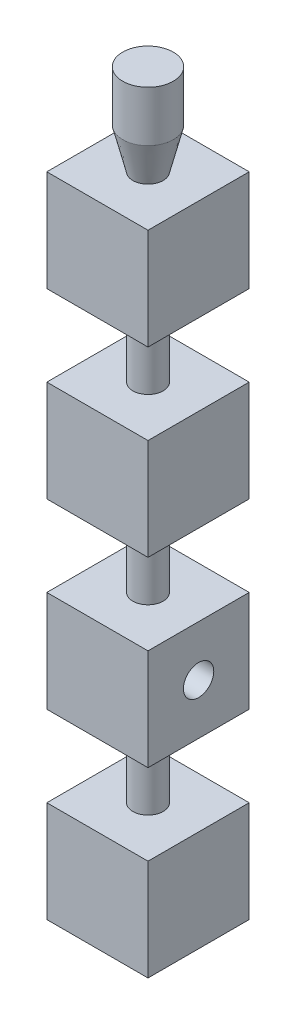
ISO-10303-21;
HEADER;
FILE_DESCRIPTION(('STEP AP214'),'2;1');
FILE_NAME('part.step','',(''),(''),'','','');
FILE_SCHEMA(('AUTOMOTIVE_DESIGN { 1 0 10303 214 1 1 1 1 }'));
ENDSEC;
DATA;
#1=APPLICATION_CONTEXT('core data for automotive mechanical design processes');
#2=APPLICATION_PROTOCOL_DEFINITION('international standard','automotive_design',2000,#1);
#3=PRODUCT_CONTEXT('',#1,'mechanical');
#4=PRODUCT('Part','Part','',(#3));
#5=PRODUCT_RELATED_PRODUCT_CATEGORY('part','',(#4));
#6=PRODUCT_DEFINITION_FORMATION('','',#4);
#7=PRODUCT_DEFINITION_CONTEXT('part definition',#1,'design');
#8=PRODUCT_DEFINITION('design','',#6,#7);
#9=PRODUCT_DEFINITION_SHAPE('','',#8);
#10=(LENGTH_UNIT() NAMED_UNIT(*) SI_UNIT(.MILLI.,.METRE.));
#11=(NAMED_UNIT(*) PLANE_ANGLE_UNIT() SI_UNIT($,.RADIAN.));
#12=(NAMED_UNIT(*) SI_UNIT($,.STERADIAN.) SOLID_ANGLE_UNIT());
#13=UNCERTAINTY_MEASURE_WITH_UNIT(LENGTH_MEASURE(1.E-05),#10,'distance_accuracy_value','');
#14=(GEOMETRIC_REPRESENTATION_CONTEXT(3) GLOBAL_UNCERTAINTY_ASSIGNED_CONTEXT((#13)) GLOBAL_UNIT_ASSIGNED_CONTEXT((#10,
#11,#12)) REPRESENTATION_CONTEXT('',''));
#15=CARTESIAN_POINT('',(0.,0.,0.));
#16=DIRECTION('',(0.,0.,1.));
#17=DIRECTION('',(1.,0.,0.));
#18=AXIS2_PLACEMENT_3D('',#15,#16,#17);
#19=CARTESIAN_POINT('',(0.,12.7,0.));
#20=DIRECTION('',(1.,0.,0.));
#21=DIRECTION('',(0.,0.,-1.));
#22=AXIS2_PLACEMENT_3D('',#19,#20,#21);
#23=PLANE('',#22);
#24=DIRECTION('',(0.,0.,1.));
#25=VECTOR('',#24,1.);
#26=CARTESIAN_POINT('',(0.,0.,0.));
#27=LINE('',#26,#25);
#28=CARTESIAN_POINT('',(0.,0.,0.));
#29=VERTEX_POINT('',#28);
#30=CARTESIAN_POINT('',(0.,0.,12.7));
#31=VERTEX_POINT('',#30);
#32=EDGE_CURVE('E290',#29,#31,#27,.T.);
#33=ORIENTED_EDGE('',*,*,#32,.T.);
#34=DIRECTION('',(0.,-1.,0.));
#35=VECTOR('',#34,1.);
#36=CARTESIAN_POINT('',(0.,12.7,12.7));
#37=LINE('',#36,#35);
#38=CARTESIAN_POINT('',(0.,12.7,12.7));
#39=VERTEX_POINT('',#38);
#40=EDGE_CURVE('E47',#39,#31,#37,.T.);
#41=ORIENTED_EDGE('',*,*,#40,.F.);
#42=DIRECTION('',(0.,0.,1.));
#43=VECTOR('',#42,1.);
#44=CARTESIAN_POINT('',(0.,12.7,0.));
#45=LINE('',#44,#43);
#46=CARTESIAN_POINT('',(0.,12.7,0.));
#47=VERTEX_POINT('',#46);
#48=EDGE_CURVE('E339',#47,#39,#45,.T.);
#49=ORIENTED_EDGE('',*,*,#48,.F.);
#50=DIRECTION('',(0.,-1.,0.));
#51=VECTOR('',#50,1.);
#52=CARTESIAN_POINT('',(0.,12.7,0.));
#53=LINE('',#52,#51);
#54=EDGE_CURVE('E349',#47,#29,#53,.T.);
#55=ORIENTED_EDGE('',*,*,#54,.T.);
#56=EDGE_LOOP('',(#33,#41,#49,#55));
#57=FACE_BOUND('',#56,.T.);
#58=ADVANCED_FACE('F44',(#57),#23,.F.);
#59=CARTESIAN_POINT('',(0.,12.7,12.7));
#60=DIRECTION('',(0.,0.,-1.));
#61=DIRECTION('',(-1.,0.,0.));
#62=AXIS2_PLACEMENT_3D('',#59,#60,#61);
#63=PLANE('',#62);
#64=DIRECTION('',(1.,0.,0.));
#65=VECTOR('',#64,1.);
#66=CARTESIAN_POINT('',(0.,0.,12.7));
#67=LINE('',#66,#65);
#68=CARTESIAN_POINT('',(12.7,0.,12.7));
#69=VERTEX_POINT('',#68);
#70=EDGE_CURVE('E353',#31,#69,#67,.T.);
#71=ORIENTED_EDGE('',*,*,#70,.T.);
#72=DIRECTION('',(0.,-1.,0.));
#73=VECTOR('',#72,1.);
#74=CARTESIAN_POINT('',(12.7,12.7,12.7));
#75=LINE('',#74,#73);
#76=CARTESIAN_POINT('',(12.7,12.7,12.7));
#77=VERTEX_POINT('',#76);
#78=EDGE_CURVE('E364',#77,#69,#75,.T.);
#79=ORIENTED_EDGE('',*,*,#78,.F.);
#80=DIRECTION('',(1.,0.,0.));
#81=VECTOR('',#80,1.);
#82=CARTESIAN_POINT('',(0.,12.7,12.7));
#83=LINE('',#82,#81);
#84=EDGE_CURVE('E95',#39,#77,#83,.T.);
#85=ORIENTED_EDGE('',*,*,#84,.F.);
#86=ORIENTED_EDGE('',*,*,#40,.T.);
#87=EDGE_LOOP('',(#71,#79,#85,#86));
#88=FACE_BOUND('',#87,.T.);
#89=ADVANCED_FACE('F369',(#88),#63,.F.);
#90=CARTESIAN_POINT('',(12.7,12.7,0.));
#91=DIRECTION('',(-1.,0.,0.));
#92=DIRECTION('',(0.,0.,1.));
#93=AXIS2_PLACEMENT_3D('',#90,#91,#92);
#94=PLANE('',#93);
#95=DIRECTION('',(0.,0.,-1.));
#96=VECTOR('',#95,1.);
#97=CARTESIAN_POINT('',(12.7,0.,0.));
#98=LINE('',#97,#96);
#99=CARTESIAN_POINT('',(12.7,0.,0.));
#100=VERTEX_POINT('',#99);
#101=EDGE_CURVE('E81',#69,#100,#98,.T.);
#102=ORIENTED_EDGE('',*,*,#101,.T.);
#103=DIRECTION('',(0.,-1.,0.));
#104=VECTOR('',#103,1.);
#105=CARTESIAN_POINT('',(12.7,12.7,0.));
#106=LINE('',#105,#104);
#107=CARTESIAN_POINT('',(12.7,12.7,0.));
#108=VERTEX_POINT('',#107);
#109=EDGE_CURVE('E362',#108,#100,#106,.T.);
#110=ORIENTED_EDGE('',*,*,#109,.F.);
#111=DIRECTION('',(0.,0.,-1.));
#112=VECTOR('',#111,1.);
#113=CARTESIAN_POINT('',(12.7,12.7,0.));
#114=LINE('',#113,#112);
#115=EDGE_CURVE('E344',#77,#108,#114,.T.);
#116=ORIENTED_EDGE('',*,*,#115,.F.);
#117=ORIENTED_EDGE('',*,*,#78,.T.);
#118=EDGE_LOOP('',(#102,#110,#116,#117));
#119=FACE_BOUND('',#118,.T.);
#120=ADVANCED_FACE('F395',(#119),#94,.F.);
#121=CARTESIAN_POINT('',(0.,12.7,0.));
#122=DIRECTION('',(0.,0.,1.));
#123=DIRECTION('',(1.,0.,0.));
#124=AXIS2_PLACEMENT_3D('',#121,#122,#123);
#125=PLANE('',#124);
#126=DIRECTION('',(-1.,0.,0.));
#127=VECTOR('',#126,1.);
#128=CARTESIAN_POINT('',(0.,0.,0.));
#129=LINE('',#128,#127);
#130=EDGE_CURVE('E87',#100,#29,#129,.T.);
#131=ORIENTED_EDGE('',*,*,#130,.T.);
#132=ORIENTED_EDGE('',*,*,#54,.F.);
#133=DIRECTION('',(-1.,0.,0.));
#134=VECTOR('',#133,1.);
#135=CARTESIAN_POINT('',(0.,12.7,0.));
#136=LINE('',#135,#134);
#137=EDGE_CURVE('E63',#108,#47,#136,.T.);
#138=ORIENTED_EDGE('',*,*,#137,.F.);
#139=ORIENTED_EDGE('',*,*,#109,.T.);
#140=EDGE_LOOP('',(#131,#132,#138,#139));
#141=FACE_BOUND('',#140,.T.);
#142=ADVANCED_FACE('F387',(#141),#125,.F.);
#143=CARTESIAN_POINT('',(0.,12.7,0.));
#144=DIRECTION('',(0.,1.,0.));
#145=DIRECTION('',(0.,0.,1.));
#146=AXIS2_PLACEMENT_3D('',#143,#144,#145);
#147=PLANE('',#146);
#148=CARTESIAN_POINT('',(6.35,12.7,6.35));
#149=DIRECTION('',(0.,1.,0.));
#150=DIRECTION('',(0.,0.,1.));
#151=AXIS2_PLACEMENT_3D('',#148,#149,#150);
#152=CIRCLE('',#151,1.905);
#153=CARTESIAN_POINT('',(6.35,12.7,8.255));
#154=VERTEX_POINT('',#153);
#155=EDGE_CURVE('E285',#154,#154,#152,.T.);
#156=ORIENTED_EDGE('',*,*,#155,.F.);
#157=EDGE_LOOP('',(#156));
#158=FACE_BOUND('',#157,.T.);
#159=ORIENTED_EDGE('',*,*,#48,.T.);
#160=ORIENTED_EDGE('',*,*,#84,.T.);
#161=ORIENTED_EDGE('',*,*,#115,.T.);
#162=ORIENTED_EDGE('',*,*,#137,.T.);
#163=EDGE_LOOP('',(#159,#160,#161,#162));
#164=FACE_BOUND('',#163,.T.);
#165=ADVANCED_FACE('F377',(#158,#164),#147,.T.);
#166=CARTESIAN_POINT('',(0.,0.,0.));
#167=DIRECTION('',(0.,1.,0.));
#168=DIRECTION('',(0.,0.,1.));
#169=AXIS2_PLACEMENT_3D('',#166,#167,#168);
#170=PLANE('',#169);
#171=ORIENTED_EDGE('',*,*,#32,.F.);
#172=ORIENTED_EDGE('',*,*,#130,.F.);
#173=ORIENTED_EDGE('',*,*,#101,.F.);
#174=ORIENTED_EDGE('',*,*,#70,.F.);
#175=EDGE_LOOP('',(#171,#172,#173,#174));
#176=FACE_BOUND('',#175,.T.);
#177=ADVANCED_FACE('F374',(#176),#170,.F.);
#178=CARTESIAN_POINT('',(6.35,17.78,6.35));
#179=DIRECTION('',(0.,-1.,0.));
#180=DIRECTION('',(0.,0.,-1.));
#181=AXIS2_PLACEMENT_3D('',#178,#179,#180);
#182=CYLINDRICAL_SURFACE('',#181,1.905);
#183=ORIENTED_EDGE('',*,*,#155,.T.);
#184=EDGE_LOOP('',(#183));
#185=FACE_BOUND('',#184,.T.);
#186=CARTESIAN_POINT('',(6.35,22.86,6.35));
#187=DIRECTION('',(0.,1.,0.));
#188=DIRECTION('',(0.,0.,1.));
#189=AXIS2_PLACEMENT_3D('',#186,#187,#188);
#190=CIRCLE('',#189,1.905);
#191=CARTESIAN_POINT('',(6.35,22.86,8.255));
#192=VERTEX_POINT('',#191);
#193=EDGE_CURVE('E286',#192,#192,#190,.T.);
#194=ORIENTED_EDGE('',*,*,#193,.F.);
#195=EDGE_LOOP('',(#194));
#196=FACE_BOUND('',#195,.T.);
#197=ADVANCED_FACE('F376',(#185,#196),#182,.T.);
#198=CARTESIAN_POINT('',(0.,22.86,0.));
#199=DIRECTION('',(1.,0.,0.));
#200=DIRECTION('',(0.,0.,-1.));
#201=AXIS2_PLACEMENT_3D('',#198,#199,#200);
#202=PLANE('',#201);
#203=DIRECTION('',(0.,0.,1.));
#204=VECTOR('',#203,1.);
#205=CARTESIAN_POINT('',(0.,35.56,0.));
#206=LINE('',#205,#204);
#207=CARTESIAN_POINT('',(0.,35.56,0.));
#208=VERTEX_POINT('',#207);
#209=CARTESIAN_POINT('',(0.,35.56,12.7));
#210=VERTEX_POINT('',#209);
#211=EDGE_CURVE('E281',#208,#210,#206,.T.);
#212=ORIENTED_EDGE('',*,*,#211,.F.);
#213=DIRECTION('',(0.,1.,0.));
#214=VECTOR('',#213,1.);
#215=CARTESIAN_POINT('',(0.,22.86,0.));
#216=LINE('',#215,#214);
#217=CARTESIAN_POINT('',(0.,22.86,0.));
#218=VERTEX_POINT('',#217);
#219=EDGE_CURVE('E308',#218,#208,#216,.T.);
#220=ORIENTED_EDGE('',*,*,#219,.F.);
#221=DIRECTION('',(0.,0.,1.));
#222=VECTOR('',#221,1.);
#223=CARTESIAN_POINT('',(0.,22.86,0.));
#224=LINE('',#223,#222);
#225=CARTESIAN_POINT('',(0.,22.86,12.7));
#226=VERTEX_POINT('',#225);
#227=EDGE_CURVE('E292',#218,#226,#224,.T.);
#228=ORIENTED_EDGE('',*,*,#227,.T.);
#229=DIRECTION('',(0.,1.,0.));
#230=VECTOR('',#229,1.);
#231=CARTESIAN_POINT('',(0.,22.86,12.7));
#232=LINE('',#231,#230);
#233=EDGE_CURVE('E291',#226,#210,#232,.T.);
#234=ORIENTED_EDGE('',*,*,#233,.T.);
#235=EDGE_LOOP('',(#212,#220,#228,#234));
#236=FACE_BOUND('',#235,.T.);
#237=ADVANCED_FACE('F384',(#236),#202,.F.);
#238=CARTESIAN_POINT('',(0.,22.86,12.7));
#239=DIRECTION('',(0.,0.,-1.));
#240=DIRECTION('',(-1.,0.,0.));
#241=AXIS2_PLACEMENT_3D('',#238,#239,#240);
#242=PLANE('',#241);
#243=DIRECTION('',(1.,0.,0.));
#244=VECTOR('',#243,1.);
#245=CARTESIAN_POINT('',(0.,35.56,12.7));
#246=LINE('',#245,#244);
#247=CARTESIAN_POINT('',(12.7,35.56,12.7));
#248=VERTEX_POINT('',#247);
#249=EDGE_CURVE('E312',#210,#248,#246,.T.);
#250=ORIENTED_EDGE('',*,*,#249,.F.);
#251=ORIENTED_EDGE('',*,*,#233,.F.);
#252=DIRECTION('',(1.,0.,0.));
#253=VECTOR('',#252,1.);
#254=CARTESIAN_POINT('',(0.,22.86,12.7));
#255=LINE('',#254,#253);
#256=CARTESIAN_POINT('',(12.7,22.86,12.7));
#257=VERTEX_POINT('',#256);
#258=EDGE_CURVE('E296',#226,#257,#255,.T.);
#259=ORIENTED_EDGE('',*,*,#258,.T.);
#260=DIRECTION('',(0.,1.,0.));
#261=VECTOR('',#260,1.);
#262=CARTESIAN_POINT('',(12.7,22.86,12.7));
#263=LINE('',#262,#261);
#264=EDGE_CURVE('E329',#257,#248,#263,.T.);
#265=ORIENTED_EDGE('',*,*,#264,.T.);
#266=EDGE_LOOP('',(#250,#251,#259,#265));
#267=FACE_BOUND('',#266,.T.);
#268=ADVANCED_FACE('F439',(#267),#242,.F.);
#269=CARTESIAN_POINT('',(12.7,22.86,0.));
#270=DIRECTION('',(-1.,0.,0.));
#271=DIRECTION('',(0.,0.,1.));
#272=AXIS2_PLACEMENT_3D('',#269,#270,#271);
#273=PLANE('',#272);
#274=CARTESIAN_POINT('',(12.7,29.21,6.35));
#275=DIRECTION('',(1.,0.,0.));
#276=DIRECTION('',(0.,0.,-1.));
#277=AXIS2_PLACEMENT_3D('',#274,#275,#276);
#278=CIRCLE('',#277,1.905);
#279=CARTESIAN_POINT('',(12.7,29.21,4.445));
#280=VERTEX_POINT('',#279);
#281=EDGE_CURVE('E685',#280,#280,#278,.T.);
#282=ORIENTED_EDGE('',*,*,#281,.F.);
#283=EDGE_LOOP('',(#282));
#284=FACE_BOUND('',#283,.T.);
#285=DIRECTION('',(0.,0.,-1.));
#286=VECTOR('',#285,1.);
#287=CARTESIAN_POINT('',(12.7,35.56,0.));
#288=LINE('',#287,#286);
#289=CARTESIAN_POINT('',(12.7,35.56,0.));
#290=VERTEX_POINT('',#289);
#291=EDGE_CURVE('E316',#248,#290,#288,.T.);
#292=ORIENTED_EDGE('',*,*,#291,.F.);
#293=ORIENTED_EDGE('',*,*,#264,.F.);
#294=DIRECTION('',(0.,0.,-1.));
#295=VECTOR('',#294,1.);
#296=CARTESIAN_POINT('',(12.7,22.86,0.));
#297=LINE('',#296,#295);
#298=CARTESIAN_POINT('',(12.7,22.86,0.));
#299=VERTEX_POINT('',#298);
#300=EDGE_CURVE('E301',#257,#299,#297,.T.);
#301=ORIENTED_EDGE('',*,*,#300,.T.);
#302=DIRECTION('',(0.,1.,0.));
#303=VECTOR('',#302,1.);
#304=CARTESIAN_POINT('',(12.7,22.86,0.));
#305=LINE('',#304,#303);
#306=EDGE_CURVE('E325',#299,#290,#305,.T.);
#307=ORIENTED_EDGE('',*,*,#306,.T.);
#308=EDGE_LOOP('',(#292,#293,#301,#307));
#309=FACE_BOUND('',#308,.T.);
#310=ADVANCED_FACE('F448',(#284,#309),#273,.F.);
#311=CARTESIAN_POINT('',(0.,22.86,0.));
#312=DIRECTION('',(0.,0.,1.));
#313=DIRECTION('',(1.,0.,0.));
#314=AXIS2_PLACEMENT_3D('',#311,#312,#313);
#315=PLANE('',#314);
#316=DIRECTION('',(-1.,0.,0.));
#317=VECTOR('',#316,1.);
#318=CARTESIAN_POINT('',(0.,35.56,0.));
#319=LINE('',#318,#317);
#320=EDGE_CURVE('E297',#290,#208,#319,.T.);
#321=ORIENTED_EDGE('',*,*,#320,.F.);
#322=ORIENTED_EDGE('',*,*,#306,.F.);
#323=DIRECTION('',(-1.,0.,0.));
#324=VECTOR('',#323,1.);
#325=CARTESIAN_POINT('',(0.,22.86,0.));
#326=LINE('',#325,#324);
#327=EDGE_CURVE('E305',#299,#218,#326,.T.);
#328=ORIENTED_EDGE('',*,*,#327,.T.);
#329=ORIENTED_EDGE('',*,*,#219,.T.);
#330=EDGE_LOOP('',(#321,#322,#328,#329));
#331=FACE_BOUND('',#330,.T.);
#332=ADVANCED_FACE('F457',(#331),#315,.F.);
#333=CARTESIAN_POINT('',(0.,22.86,0.));
#334=DIRECTION('',(0.,-1.,0.));
#335=DIRECTION('',(0.,0.,1.));
#336=AXIS2_PLACEMENT_3D('',#333,#334,#335);
#337=PLANE('',#336);
#338=ORIENTED_EDGE('',*,*,#193,.T.);
#339=EDGE_LOOP('',(#338));
#340=FACE_BOUND('',#339,.T.);
#341=ORIENTED_EDGE('',*,*,#227,.F.);
#342=ORIENTED_EDGE('',*,*,#327,.F.);
#343=ORIENTED_EDGE('',*,*,#300,.F.);
#344=ORIENTED_EDGE('',*,*,#258,.F.);
#345=EDGE_LOOP('',(#341,#342,#343,#344));
#346=FACE_BOUND('',#345,.T.);
#347=ADVANCED_FACE('F466',(#340,#346),#337,.T.);
#348=CARTESIAN_POINT('',(0.,35.56,0.));
#349=DIRECTION('',(0.,-1.,0.));
#350=DIRECTION('',(0.,0.,1.));
#351=AXIS2_PLACEMENT_3D('',#348,#349,#350);
#352=PLANE('',#351);
#353=CARTESIAN_POINT('',(6.35,35.56,6.35));
#354=DIRECTION('',(0.,1.,0.));
#355=DIRECTION('',(0.,0.,1.));
#356=AXIS2_PLACEMENT_3D('',#353,#354,#355);
#357=CIRCLE('',#356,1.905);
#358=CARTESIAN_POINT('',(6.35,35.56,8.255));
#359=VERTEX_POINT('',#358);
#360=EDGE_CURVE('E235',#359,#359,#357,.T.);
#361=ORIENTED_EDGE('',*,*,#360,.F.);
#362=EDGE_LOOP('',(#361));
#363=FACE_BOUND('',#362,.T.);
#364=ORIENTED_EDGE('',*,*,#211,.T.);
#365=ORIENTED_EDGE('',*,*,#249,.T.);
#366=ORIENTED_EDGE('',*,*,#291,.T.);
#367=ORIENTED_EDGE('',*,*,#320,.T.);
#368=EDGE_LOOP('',(#364,#365,#366,#367));
#369=FACE_BOUND('',#368,.T.);
#370=ADVANCED_FACE('F475',(#363,#369),#352,.F.);
#371=CARTESIAN_POINT('',(6.35,40.64,6.35));
#372=DIRECTION('',(0.,-1.,0.));
#373=DIRECTION('',(0.,0.,-1.));
#374=AXIS2_PLACEMENT_3D('',#371,#372,#373);
#375=CYLINDRICAL_SURFACE('',#374,1.905);
#376=ORIENTED_EDGE('',*,*,#360,.T.);
#377=EDGE_LOOP('',(#376));
#378=FACE_BOUND('',#377,.T.);
#379=CARTESIAN_POINT('',(6.35,45.72,6.35));
#380=DIRECTION('',(0.,1.,0.));
#381=DIRECTION('',(0.,0.,1.));
#382=AXIS2_PLACEMENT_3D('',#379,#380,#381);
#383=CIRCLE('',#382,1.905);
#384=CARTESIAN_POINT('',(6.35,45.72,8.255));
#385=VERTEX_POINT('',#384);
#386=EDGE_CURVE('E277',#385,#385,#383,.T.);
#387=ORIENTED_EDGE('',*,*,#386,.F.);
#388=EDGE_LOOP('',(#387));
#389=FACE_BOUND('',#388,.T.);
#390=ADVANCED_FACE('F484',(#378,#389),#375,.T.);
#391=CARTESIAN_POINT('',(0.,58.42,12.7));
#392=DIRECTION('',(1.,0.,0.));
#393=DIRECTION('',(0.,0.,-1.));
#394=AXIS2_PLACEMENT_3D('',#391,#392,#393);
#395=PLANE('',#394);
#396=DIRECTION('',(0.,0.,1.));
#397=VECTOR('',#396,1.);
#398=CARTESIAN_POINT('',(0.,45.72,12.7));
#399=LINE('',#398,#397);
#400=CARTESIAN_POINT('',(0.,45.72,0.));
#401=VERTEX_POINT('',#400);
#402=CARTESIAN_POINT('',(0.,45.72,12.7));
#403=VERTEX_POINT('',#402);
#404=EDGE_CURVE('E192',#401,#403,#399,.T.);
#405=ORIENTED_EDGE('',*,*,#404,.T.);
#406=DIRECTION('',(0.,-1.,0.));
#407=VECTOR('',#406,1.);
#408=CARTESIAN_POINT('',(0.,58.42,12.7));
#409=LINE('',#408,#407);
#410=CARTESIAN_POINT('',(0.,58.42,12.7));
#411=VERTEX_POINT('',#410);
#412=EDGE_CURVE('E273',#411,#403,#409,.T.);
#413=ORIENTED_EDGE('',*,*,#412,.F.);
#414=DIRECTION('',(0.,0.,1.));
#415=VECTOR('',#414,1.);
#416=CARTESIAN_POINT('',(0.,58.42,12.7));
#417=LINE('',#416,#415);
#418=CARTESIAN_POINT('',(0.,58.42,0.));
#419=VERTEX_POINT('',#418);
#420=EDGE_CURVE('E236',#419,#411,#417,.T.);
#421=ORIENTED_EDGE('',*,*,#420,.F.);
#422=DIRECTION('',(0.,-1.,0.));
#423=VECTOR('',#422,1.);
#424=CARTESIAN_POINT('',(0.,58.42,0.));
#425=LINE('',#424,#423);
#426=EDGE_CURVE('E250',#419,#401,#425,.T.);
#427=ORIENTED_EDGE('',*,*,#426,.T.);
#428=EDGE_LOOP('',(#405,#413,#421,#427));
#429=FACE_BOUND('',#428,.T.);
#430=ADVANCED_FACE('F493',(#429),#395,.F.);
#431=CARTESIAN_POINT('',(0.,58.42,12.7));
#432=DIRECTION('',(0.,0.,-1.));
#433=DIRECTION('',(-1.,0.,0.));
#434=AXIS2_PLACEMENT_3D('',#431,#432,#433);
#435=PLANE('',#434);
#436=DIRECTION('',(1.,0.,0.));
#437=VECTOR('',#436,1.);
#438=CARTESIAN_POINT('',(0.,45.72,12.7));
#439=LINE('',#438,#437);
#440=CARTESIAN_POINT('',(12.7,45.72,12.7));
#441=VERTEX_POINT('',#440);
#442=EDGE_CURVE('E254',#403,#441,#439,.T.);
#443=ORIENTED_EDGE('',*,*,#442,.T.);
#444=DIRECTION('',(0.,-1.,0.));
#445=VECTOR('',#444,1.);
#446=CARTESIAN_POINT('',(12.7,58.42,12.7));
#447=LINE('',#446,#445);
#448=CARTESIAN_POINT('',(12.7,58.42,12.7));
#449=VERTEX_POINT('',#448);
#450=EDGE_CURVE('E269',#449,#441,#447,.T.);
#451=ORIENTED_EDGE('',*,*,#450,.F.);
#452=DIRECTION('',(1.,0.,0.));
#453=VECTOR('',#452,1.);
#454=CARTESIAN_POINT('',(0.,58.42,12.7));
#455=LINE('',#454,#453);
#456=EDGE_CURVE('E240',#411,#449,#455,.T.);
#457=ORIENTED_EDGE('',*,*,#456,.F.);
#458=ORIENTED_EDGE('',*,*,#412,.T.);
#459=EDGE_LOOP('',(#443,#451,#457,#458));
#460=FACE_BOUND('',#459,.T.);
#461=ADVANCED_FACE('F502',(#460),#435,.F.);
#462=CARTESIAN_POINT('',(12.7,58.42,12.7));
#463=DIRECTION('',(-1.,0.,0.));
#464=DIRECTION('',(0.,0.,1.));
#465=AXIS2_PLACEMENT_3D('',#462,#463,#464);
#466=PLANE('',#465);
#467=DIRECTION('',(0.,0.,-1.));
#468=VECTOR('',#467,1.);
#469=CARTESIAN_POINT('',(12.7,45.72,12.7));
#470=LINE('',#469,#468);
#471=CARTESIAN_POINT('',(12.7,45.72,0.));
#472=VERTEX_POINT('',#471);
#473=EDGE_CURVE('E257',#441,#472,#470,.T.);
#474=ORIENTED_EDGE('',*,*,#473,.T.);
#475=DIRECTION('',(0.,-1.,0.));
#476=VECTOR('',#475,1.);
#477=CARTESIAN_POINT('',(12.7,58.42,0.));
#478=LINE('',#477,#476);
#479=CARTESIAN_POINT('',(12.7,58.42,0.));
#480=VERTEX_POINT('',#479);
#481=EDGE_CURVE('E265',#480,#472,#478,.T.);
#482=ORIENTED_EDGE('',*,*,#481,.F.);
#483=DIRECTION('',(0.,0.,-1.));
#484=VECTOR('',#483,1.);
#485=CARTESIAN_POINT('',(12.7,58.42,12.7));
#486=LINE('',#485,#484);
#487=EDGE_CURVE('E244',#449,#480,#486,.T.);
#488=ORIENTED_EDGE('',*,*,#487,.F.);
#489=ORIENTED_EDGE('',*,*,#450,.T.);
#490=EDGE_LOOP('',(#474,#482,#488,#489));
#491=FACE_BOUND('',#490,.T.);
#492=ADVANCED_FACE('F511',(#491),#466,.F.);
#493=CARTESIAN_POINT('',(0.,58.42,0.));
#494=DIRECTION('',(0.,0.,1.));
#495=DIRECTION('',(1.,0.,0.));
#496=AXIS2_PLACEMENT_3D('',#493,#494,#495);
#497=PLANE('',#496);
#498=DIRECTION('',(-1.,0.,0.));
#499=VECTOR('',#498,1.);
#500=CARTESIAN_POINT('',(0.,45.72,0.));
#501=LINE('',#500,#499);
#502=EDGE_CURVE('E241',#472,#401,#501,.T.);
#503=ORIENTED_EDGE('',*,*,#502,.T.);
#504=ORIENTED_EDGE('',*,*,#426,.F.);
#505=DIRECTION('',(-1.,0.,0.));
#506=VECTOR('',#505,1.);
#507=CARTESIAN_POINT('',(0.,58.42,0.));
#508=LINE('',#507,#506);
#509=EDGE_CURVE('E247',#480,#419,#508,.T.);
#510=ORIENTED_EDGE('',*,*,#509,.F.);
#511=ORIENTED_EDGE('',*,*,#481,.T.);
#512=EDGE_LOOP('',(#503,#504,#510,#511));
#513=FACE_BOUND('',#512,.T.);
#514=ADVANCED_FACE('F520',(#513),#497,.F.);
#515=CARTESIAN_POINT('',(0.,58.42,0.));
#516=DIRECTION('',(0.,-1.,0.));
#517=DIRECTION('',(0.,0.,-1.));
#518=AXIS2_PLACEMENT_3D('',#515,#516,#517);
#519=PLANE('',#518);
#520=CARTESIAN_POINT('',(6.35,58.42,6.35));
#521=DIRECTION('',(0.,1.,0.));
#522=DIRECTION('',(0.,0.,1.));
#523=AXIS2_PLACEMENT_3D('',#520,#521,#522);
#524=CIRCLE('',#523,1.905);
#525=CARTESIAN_POINT('',(6.35,58.42,8.255));
#526=VERTEX_POINT('',#525);
#527=EDGE_CURVE('E54',#526,#526,#524,.T.);
#528=ORIENTED_EDGE('',*,*,#527,.F.);
#529=EDGE_LOOP('',(#528));
#530=FACE_BOUND('',#529,.T.);
#531=ORIENTED_EDGE('',*,*,#420,.T.);
#532=ORIENTED_EDGE('',*,*,#456,.T.);
#533=ORIENTED_EDGE('',*,*,#487,.T.);
#534=ORIENTED_EDGE('',*,*,#509,.T.);
#535=EDGE_LOOP('',(#531,#532,#533,#534));
#536=FACE_BOUND('',#535,.T.);
#537=ADVANCED_FACE('F529',(#530,#536),#519,.F.);
#538=CARTESIAN_POINT('',(0.,45.72,0.));
#539=DIRECTION('',(0.,-1.,0.));
#540=DIRECTION('',(0.,0.,-1.));
#541=AXIS2_PLACEMENT_3D('',#538,#539,#540);
#542=PLANE('',#541);
#543=ORIENTED_EDGE('',*,*,#386,.T.);
#544=EDGE_LOOP('',(#543));
#545=FACE_BOUND('',#544,.T.);
#546=ORIENTED_EDGE('',*,*,#404,.F.);
#547=ORIENTED_EDGE('',*,*,#502,.F.);
#548=ORIENTED_EDGE('',*,*,#473,.F.);
#549=ORIENTED_EDGE('',*,*,#442,.F.);
#550=EDGE_LOOP('',(#546,#547,#548,#549));
#551=FACE_BOUND('',#550,.T.);
#552=ADVANCED_FACE('F538',(#545,#551),#542,.T.);
#553=CARTESIAN_POINT('',(6.35,63.5,6.35));
#554=DIRECTION('',(0.,-1.,0.));
#555=DIRECTION('',(0.,0.,-1.));
#556=AXIS2_PLACEMENT_3D('',#553,#554,#555);
#557=CYLINDRICAL_SURFACE('',#556,1.905);
#558=ORIENTED_EDGE('',*,*,#527,.T.);
#559=EDGE_LOOP('',(#558));
#560=FACE_BOUND('',#559,.T.);
#561=CARTESIAN_POINT('',(6.35,68.58,6.35));
#562=DIRECTION('',(0.,1.,0.));
#563=DIRECTION('',(0.,0.,1.));
#564=AXIS2_PLACEMENT_3D('',#561,#562,#563);
#565=CIRCLE('',#564,1.905);
#566=CARTESIAN_POINT('',(6.35,68.58,8.255));
#567=VERTEX_POINT('',#566);
#568=EDGE_CURVE('E199',#567,#567,#565,.T.);
#569=ORIENTED_EDGE('',*,*,#568,.F.);
#570=EDGE_LOOP('',(#569));
#571=FACE_BOUND('',#570,.T.);
#572=ADVANCED_FACE('F547',(#560,#571),#557,.T.);
#573=CARTESIAN_POINT('',(0.,68.58,12.7));
#574=DIRECTION('',(1.,0.,0.));
#575=DIRECTION('',(0.,0.,-1.));
#576=AXIS2_PLACEMENT_3D('',#573,#574,#575);
#577=PLANE('',#576);
#578=DIRECTION('',(0.,0.,1.));
#579=VECTOR('',#578,1.);
#580=CARTESIAN_POINT('',(0.,81.28,12.7));
#581=LINE('',#580,#579);
#582=CARTESIAN_POINT('',(0.,81.28,0.));
#583=VERTEX_POINT('',#582);
#584=CARTESIAN_POINT('',(0.,81.28,12.7));
#585=VERTEX_POINT('',#584);
#586=EDGE_CURVE('E221',#583,#585,#581,.T.);
#587=ORIENTED_EDGE('',*,*,#586,.F.);
#588=DIRECTION('',(0.,1.,0.));
#589=VECTOR('',#588,1.);
#590=CARTESIAN_POINT('',(0.,68.58,0.));
#591=LINE('',#590,#589);
#592=CARTESIAN_POINT('',(0.,68.58,0.));
#593=VERTEX_POINT('',#592);
#594=EDGE_CURVE('E197',#593,#583,#591,.T.);
#595=ORIENTED_EDGE('',*,*,#594,.F.);
#596=DIRECTION('',(0.,0.,1.));
#597=VECTOR('',#596,1.);
#598=CARTESIAN_POINT('',(0.,68.58,12.7));
#599=LINE('',#598,#597);
#600=CARTESIAN_POINT('',(0.,68.58,12.7));
#601=VERTEX_POINT('',#600);
#602=EDGE_CURVE('E174',#593,#601,#599,.T.);
#603=ORIENTED_EDGE('',*,*,#602,.T.);
#604=DIRECTION('',(0.,1.,0.));
#605=VECTOR('',#604,1.);
#606=CARTESIAN_POINT('',(0.,68.58,12.7));
#607=LINE('',#606,#605);
#608=EDGE_CURVE('E184',#601,#585,#607,.T.);
#609=ORIENTED_EDGE('',*,*,#608,.T.);
#610=EDGE_LOOP('',(#587,#595,#603,#609));
#611=FACE_BOUND('',#610,.T.);
#612=ADVANCED_FACE('F195',(#611),#577,.F.);
#613=CARTESIAN_POINT('',(0.,68.58,12.7));
#614=DIRECTION('',(0.,0.,-1.));
#615=DIRECTION('',(-1.,0.,0.));
#616=AXIS2_PLACEMENT_3D('',#613,#614,#615);
#617=PLANE('',#616);
#618=DIRECTION('',(1.,0.,0.));
#619=VECTOR('',#618,1.);
#620=CARTESIAN_POINT('',(0.,81.28,12.7));
#621=LINE('',#620,#619);
#622=CARTESIAN_POINT('',(12.7,81.28,12.7));
#623=VERTEX_POINT('',#622);
#624=EDGE_CURVE('E187',#585,#623,#621,.T.);
#625=ORIENTED_EDGE('',*,*,#624,.F.);
#626=ORIENTED_EDGE('',*,*,#608,.F.);
#627=DIRECTION('',(1.,0.,0.));
#628=VECTOR('',#627,1.);
#629=CARTESIAN_POINT('',(0.,68.58,12.7));
#630=LINE('',#629,#628);
#631=CARTESIAN_POINT('',(12.7,68.58,12.7));
#632=VERTEX_POINT('',#631);
#633=EDGE_CURVE('E170',#601,#632,#630,.T.);
#634=ORIENTED_EDGE('',*,*,#633,.T.);
#635=DIRECTION('',(0.,1.,0.));
#636=VECTOR('',#635,1.);
#637=CARTESIAN_POINT('',(12.7,68.58,12.7));
#638=LINE('',#637,#636);
#639=EDGE_CURVE('E193',#632,#623,#638,.T.);
#640=ORIENTED_EDGE('',*,*,#639,.T.);
#641=EDGE_LOOP('',(#625,#626,#634,#640));
#642=FACE_BOUND('',#641,.T.);
#643=ADVANCED_FACE('F185',(#642),#617,.F.);
#644=CARTESIAN_POINT('',(12.7,68.58,12.7));
#645=DIRECTION('',(-1.,0.,0.));
#646=DIRECTION('',(0.,0.,1.));
#647=AXIS2_PLACEMENT_3D('',#644,#645,#646);
#648=PLANE('',#647);
#649=DIRECTION('',(0.,0.,-1.));
#650=VECTOR('',#649,1.);
#651=CARTESIAN_POINT('',(12.7,81.28,12.7));
#652=LINE('',#651,#650);
#653=CARTESIAN_POINT('',(12.7,81.28,0.));
#654=VERTEX_POINT('',#653);
#655=EDGE_CURVE('E224',#623,#654,#652,.T.);
#656=ORIENTED_EDGE('',*,*,#655,.F.);
#657=ORIENTED_EDGE('',*,*,#639,.F.);
#658=DIRECTION('',(0.,0.,-1.));
#659=VECTOR('',#658,1.);
#660=CARTESIAN_POINT('',(12.7,68.58,12.7));
#661=LINE('',#660,#659);
#662=CARTESIAN_POINT('',(12.7,68.58,0.));
#663=VERTEX_POINT('',#662);
#664=EDGE_CURVE('E177',#632,#663,#661,.T.);
#665=ORIENTED_EDGE('',*,*,#664,.T.);
#666=DIRECTION('',(0.,1.,0.));
#667=VECTOR('',#666,1.);
#668=CARTESIAN_POINT('',(12.7,68.58,0.));
#669=LINE('',#668,#667);
#670=EDGE_CURVE('E217',#663,#654,#669,.T.);
#671=ORIENTED_EDGE('',*,*,#670,.T.);
#672=EDGE_LOOP('',(#656,#657,#665,#671));
#673=FACE_BOUND('',#672,.T.);
#674=ADVANCED_FACE('F571',(#673),#648,.F.);
#675=CARTESIAN_POINT('',(0.,81.28,0.));
#676=DIRECTION('',(0.,1.,0.));
#677=DIRECTION('',(0.,0.,-1.));
#678=AXIS2_PLACEMENT_3D('',#675,#676,#677);
#679=PLANE('',#678);
#680=CARTESIAN_POINT('',(6.35,81.28,6.35));
#681=DIRECTION('',(0.,1.,0.));
#682=DIRECTION('',(0.,0.,1.));
#683=AXIS2_PLACEMENT_3D('',#680,#681,#682);
#684=CIRCLE('',#683,1.905);
#685=CARTESIAN_POINT('',(6.35,81.28,8.255));
#686=VERTEX_POINT('',#685);
#687=EDGE_CURVE('E11',#686,#686,#684,.T.);
#688=ORIENTED_EDGE('',*,*,#687,.F.);
#689=EDGE_LOOP('',(#688));
#690=FACE_BOUND('',#689,.T.);
#691=ORIENTED_EDGE('',*,*,#586,.T.);
#692=ORIENTED_EDGE('',*,*,#624,.T.);
#693=ORIENTED_EDGE('',*,*,#655,.T.);
#694=DIRECTION('',(-1.,0.,0.));
#695=VECTOR('',#694,1.);
#696=CARTESIAN_POINT('',(0.,81.28,0.));
#697=LINE('',#696,#695);
#698=EDGE_CURVE('E212',#654,#583,#697,.T.);
#699=ORIENTED_EDGE('',*,*,#698,.T.);
#700=EDGE_LOOP('',(#691,#692,#693,#699));
#701=FACE_BOUND('',#700,.T.);
#702=ADVANCED_FACE('F579',(#690,#701),#679,.T.);
#703=CARTESIAN_POINT('',(0.,68.58,0.));
#704=DIRECTION('',(0.,0.,1.));
#705=DIRECTION('',(1.,0.,0.));
#706=AXIS2_PLACEMENT_3D('',#703,#704,#705);
#707=PLANE('',#706);
#708=ORIENTED_EDGE('',*,*,#698,.F.);
#709=ORIENTED_EDGE('',*,*,#670,.F.);
#710=DIRECTION('',(-1.,0.,0.));
#711=VECTOR('',#710,1.);
#712=CARTESIAN_POINT('',(0.,68.58,0.));
#713=LINE('',#712,#711);
#714=EDGE_CURVE('E209',#663,#593,#713,.T.);
#715=ORIENTED_EDGE('',*,*,#714,.T.);
#716=ORIENTED_EDGE('',*,*,#594,.T.);
#717=EDGE_LOOP('',(#708,#709,#715,#716));
#718=FACE_BOUND('',#717,.T.);
#719=ADVANCED_FACE('F588',(#718),#707,.F.);
#720=CARTESIAN_POINT('',(0.,68.58,0.));
#721=DIRECTION('',(0.,1.,0.));
#722=DIRECTION('',(0.,0.,-1.));
#723=AXIS2_PLACEMENT_3D('',#720,#721,#722);
#724=PLANE('',#723);
#725=ORIENTED_EDGE('',*,*,#568,.T.);
#726=EDGE_LOOP('',(#725));
#727=FACE_BOUND('',#726,.T.);
#728=ORIENTED_EDGE('',*,*,#602,.F.);
#729=ORIENTED_EDGE('',*,*,#714,.F.);
#730=ORIENTED_EDGE('',*,*,#664,.F.);
#731=ORIENTED_EDGE('',*,*,#633,.F.);
#732=EDGE_LOOP('',(#728,#729,#730,#731));
#733=FACE_BOUND('',#732,.T.);
#734=ADVANCED_FACE('F172',(#727,#733),#724,.F.);
#735=CARTESIAN_POINT('',(6.35,81.28,6.35));
#736=DIRECTION('',(0.,1.,0.));
#737=DIRECTION('',(0.,0.,1.));
#738=AXIS2_PLACEMENT_3D('',#735,#736,#737);
#739=CONICAL_SURFACE('',#738,1.905,0.244346095279207);
#740=CARTESIAN_POINT('',(6.35,86.36,6.35));
#741=DIRECTION('',(0.,1.,0.));
#742=DIRECTION('',(0.,0.,1.));
#743=AXIS2_PLACEMENT_3D('',#740,#741,#742);
#744=CIRCLE('',#743,3.17158625444336);
#745=CARTESIAN_POINT('',(6.35,86.36,9.52158625444336));
#746=VERTEX_POINT('',#745);
#747=EDGE_CURVE('E203',#746,#746,#744,.T.);
#748=ORIENTED_EDGE('',*,*,#747,.F.);
#749=EDGE_LOOP('',(#748));
#750=FACE_BOUND('',#749,.T.);
#751=ORIENTED_EDGE('',*,*,#687,.T.);
#752=EDGE_LOOP('',(#751));
#753=FACE_BOUND('',#752,.T.);
#754=ADVANCED_FACE('F605',(#750,#753),#739,.T.);
#755=CARTESIAN_POINT('',(6.35,92.71,6.35));
#756=DIRECTION('',(0.,-1.,0.));
#757=DIRECTION('',(0.,0.,-1.));
#758=AXIS2_PLACEMENT_3D('',#755,#756,#757);
#759=CYLINDRICAL_SURFACE('',#758,3.17158625444337);
#760=CARTESIAN_POINT('',(6.35,92.71,6.35));
#761=DIRECTION('',(0.,1.,0.));
#762=DIRECTION('',(0.,0.,1.));
#763=AXIS2_PLACEMENT_3D('',#760,#761,#762);
#764=CIRCLE('',#763,3.17158625444337);
#765=CARTESIAN_POINT('',(6.35,92.71,9.52158625444337));
#766=VERTEX_POINT('',#765);
#767=EDGE_CURVE('E684',#766,#766,#764,.T.);
#768=ORIENTED_EDGE('',*,*,#767,.F.);
#769=EDGE_LOOP('',(#768));
#770=FACE_BOUND('',#769,.T.);
#771=ORIENTED_EDGE('',*,*,#747,.T.);
#772=EDGE_LOOP('',(#771));
#773=FACE_BOUND('',#772,.T.);
#774=ADVANCED_FACE('F614',(#770,#773),#759,.T.);
#775=CARTESIAN_POINT('',(6.35,92.71,6.35));
#776=DIRECTION('',(0.,1.,0.));
#777=DIRECTION('',(0.,0.,1.));
#778=AXIS2_PLACEMENT_3D('',#775,#776,#777);
#779=PLANE('',#778);
#780=ORIENTED_EDGE('',*,*,#767,.T.);
#781=EDGE_LOOP('',(#780));
#782=FACE_BOUND('',#781,.T.);
#783=ADVANCED_FACE('F623',(#782),#779,.T.);
#784=CARTESIAN_POINT('',(6.35,29.21,6.35));
#785=DIRECTION('',(1.,0.,0.));
#786=DIRECTION('',(0.,0.,-1.));
#787=AXIS2_PLACEMENT_3D('',#784,#785,#786);
#788=CYLINDRICAL_SURFACE('',#787,1.905);
#789=CARTESIAN_POINT('',(6.35,29.21,6.35));
#790=DIRECTION('',(1.,0.,0.));
#791=DIRECTION('',(0.,0.,-1.));
#792=AXIS2_PLACEMENT_3D('',#789,#790,#791);
#793=CIRCLE('',#792,1.905);
#794=CARTESIAN_POINT('',(6.35,29.21,4.445));
#795=VERTEX_POINT('',#794);
#796=EDGE_CURVE('E682',#795,#795,#793,.T.);
#797=ORIENTED_EDGE('',*,*,#796,.F.);
#798=EDGE_LOOP('',(#797));
#799=FACE_BOUND('',#798,.T.);
#800=ORIENTED_EDGE('',*,*,#281,.T.);
#801=EDGE_LOOP('',(#800));
#802=FACE_BOUND('',#801,.T.);
#803=ADVANCED_FACE('F632',(#799,#802),#788,.F.);
#804=CARTESIAN_POINT('',(6.35,29.21,6.35));
#805=DIRECTION('',(1.,0.,0.));
#806=DIRECTION('',(0.,0.,-1.));
#807=AXIS2_PLACEMENT_3D('',#804,#805,#806);
#808=PLANE('',#807);
#809=ORIENTED_EDGE('',*,*,#796,.T.);
#810=EDGE_LOOP('',(#809));
#811=FACE_BOUND('',#810,.T.);
#812=ADVANCED_FACE('F641',(#811),#808,.T.);
#813=CLOSED_SHELL('',(#58,#89,#120,#142,#165,#177,#197,#237,#268,#310,#332,#347,#370,#390,#430,
#461,#492,#514,#537,#552,#572,#612,#643,#674,#702,#719,#734,#754,#774,#783,#803,#812));
#814=MANIFOLD_SOLID_BREP('B2',#813);
#815=ADVANCED_BREP_SHAPE_REPRESENTATION('',(#18,#814),#14);
#816=SHAPE_DEFINITION_REPRESENTATION(#9,#815);
ENDSEC;
END-ISO-10303-21;
